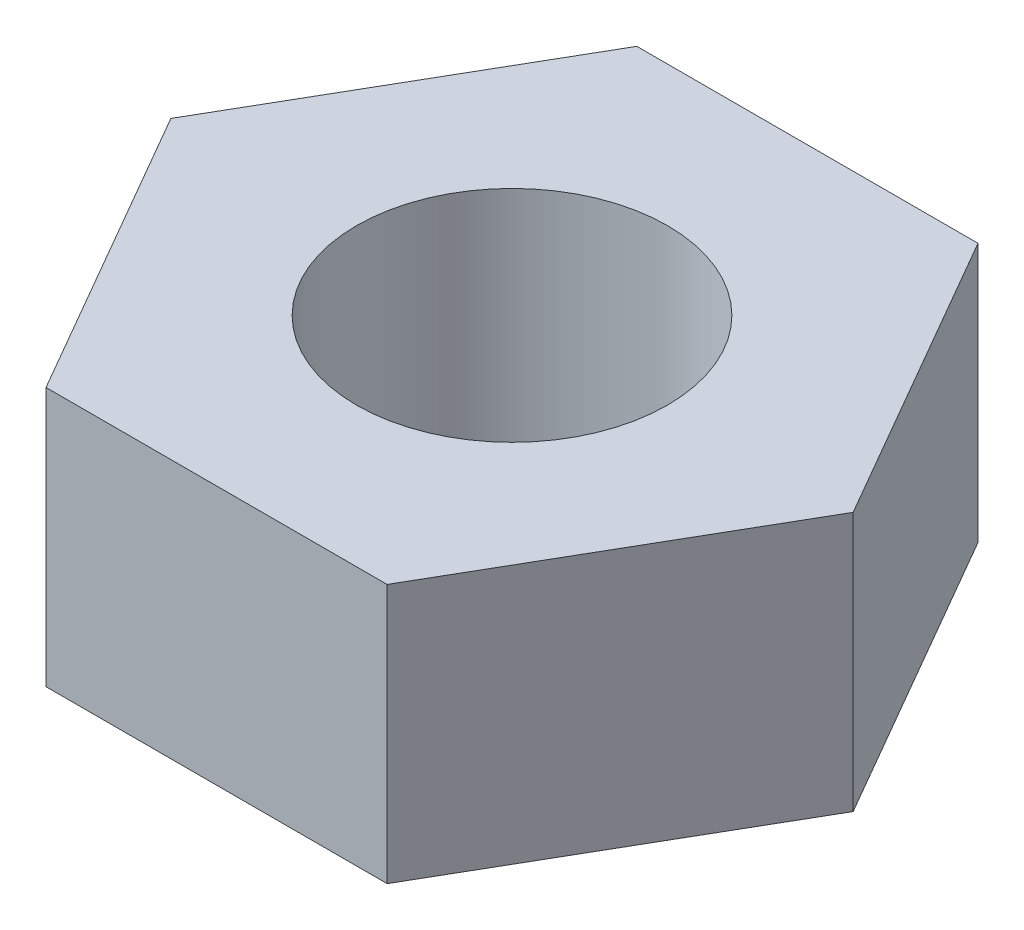
ISO-10303-21;
HEADER;
FILE_DESCRIPTION(('STEP AP214'),'2;1');
FILE_NAME('part.step','',(''),(''),'','','');
FILE_SCHEMA(('AUTOMOTIVE_DESIGN { 1 0 10303 214 1 1 1 1 }'));
ENDSEC;
DATA;
#1=APPLICATION_CONTEXT('core data for automotive mechanical design processes');
#2=APPLICATION_PROTOCOL_DEFINITION('international standard','automotive_design',2000,#1);
#3=PRODUCT_CONTEXT('',#1,'mechanical');
#4=PRODUCT('Part','Part','',(#3));
#5=PRODUCT_RELATED_PRODUCT_CATEGORY('part','',(#4));
#6=PRODUCT_DEFINITION_FORMATION('','',#4);
#7=PRODUCT_DEFINITION_CONTEXT('part definition',#1,'design');
#8=PRODUCT_DEFINITION('design','',#6,#7);
#9=PRODUCT_DEFINITION_SHAPE('','',#8);
#10=(LENGTH_UNIT() NAMED_UNIT(*) SI_UNIT(.MILLI.,.METRE.));
#11=(NAMED_UNIT(*) PLANE_ANGLE_UNIT() SI_UNIT($,.RADIAN.));
#12=(NAMED_UNIT(*) SI_UNIT($,.STERADIAN.) SOLID_ANGLE_UNIT());
#13=UNCERTAINTY_MEASURE_WITH_UNIT(LENGTH_MEASURE(1.E-05),#10,'distance_accuracy_value','');
#14=(GEOMETRIC_REPRESENTATION_CONTEXT(3) GLOBAL_UNCERTAINTY_ASSIGNED_CONTEXT((#13)) GLOBAL_UNIT_ASSIGNED_CONTEXT((#10,
#11,#12)) REPRESENTATION_CONTEXT('',''));
#15=CARTESIAN_POINT('',(0.,0.,0.));
#16=DIRECTION('',(0.,0.,1.));
#17=DIRECTION('',(1.,0.,0.));
#18=AXIS2_PLACEMENT_3D('',#15,#16,#17);
#19=CARTESIAN_POINT('',(0.,2.5,0.));
#20=DIRECTION('',(0.,1.,0.));
#21=DIRECTION('',(0.,0.,1.));
#22=AXIS2_PLACEMENT_3D('',#19,#20,#21);
#23=PLANE('',#22);
#24=DIRECTION('',(0.5,0.,-0.866025403784439));
#25=VECTOR('',#24,1.);
#26=CARTESIAN_POINT('',(1.64544826719043,2.5,2.85));
#27=LINE('',#26,#25);
#28=CARTESIAN_POINT('',(1.64544826719043,2.5,2.85));
#29=VERTEX_POINT('',#28);
#30=CARTESIAN_POINT('',(3.29089653438087,2.5,0.));
#31=VERTEX_POINT('',#30);
#32=EDGE_CURVE('E135',#29,#31,#27,.T.);
#33=ORIENTED_EDGE('',*,*,#32,.T.);
#34=DIRECTION('',(-0.5,0.,-0.866025403784439));
#35=VECTOR('',#34,1.);
#36=CARTESIAN_POINT('',(3.29089653438087,2.5,0.));
#37=LINE('',#36,#35);
#38=CARTESIAN_POINT('',(1.64544826719043,2.5,-2.85));
#39=VERTEX_POINT('',#38);
#40=EDGE_CURVE('E93',#31,#39,#37,.T.);
#41=ORIENTED_EDGE('',*,*,#40,.T.);
#42=DIRECTION('',(-1.,0.,0.));
#43=VECTOR('',#42,1.);
#44=CARTESIAN_POINT('',(1.64544826719043,2.5,-2.85));
#45=LINE('',#44,#43);
#46=CARTESIAN_POINT('',(-1.64544826719043,2.5,-2.85));
#47=VERTEX_POINT('',#46);
#48=EDGE_CURVE('E106',#39,#47,#45,.T.);
#49=ORIENTED_EDGE('',*,*,#48,.T.);
#50=DIRECTION('',(-0.5,0.,0.866025403784439));
#51=VECTOR('',#50,1.);
#52=CARTESIAN_POINT('',(-1.64544826719043,2.5,-2.85));
#53=LINE('',#52,#51);
#54=CARTESIAN_POINT('',(-3.29089653438087,2.5,0.));
#55=VERTEX_POINT('',#54);
#56=EDGE_CURVE('E100',#47,#55,#53,.T.);
#57=ORIENTED_EDGE('',*,*,#56,.T.);
#58=DIRECTION('',(0.5,0.,0.866025403784438));
#59=VECTOR('',#58,1.);
#60=CARTESIAN_POINT('',(-3.29089653438087,2.5,0.));
#61=LINE('',#60,#59);
#62=CARTESIAN_POINT('',(-1.64544826719043,2.5,2.85));
#63=VERTEX_POINT('',#62);
#64=EDGE_CURVE('E104',#55,#63,#61,.T.);
#65=ORIENTED_EDGE('',*,*,#64,.T.);
#66=DIRECTION('',(1.,0.,0.));
#67=VECTOR('',#66,1.);
#68=CARTESIAN_POINT('',(-1.64544826719043,2.5,2.85));
#69=LINE('',#68,#67);
#70=EDGE_CURVE('E56',#63,#29,#69,.T.);
#71=ORIENTED_EDGE('',*,*,#70,.T.);
#72=EDGE_LOOP('',(#33,#41,#49,#57,#65,#71));
#73=FACE_BOUND('',#72,.T.);
#74=CARTESIAN_POINT('',(0.,2.5,0.));
#75=DIRECTION('',(0.,1.,0.));
#76=DIRECTION('',(0.,0.,1.));
#77=AXIS2_PLACEMENT_3D('',#74,#75,#76);
#78=CIRCLE('',#77,1.50000000000006);
#79=CARTESIAN_POINT('',(0.,2.5,1.50000000000006));
#80=VERTEX_POINT('',#79);
#81=EDGE_CURVE('E128',#80,#80,#78,.T.);
#82=ORIENTED_EDGE('',*,*,#81,.F.);
#83=EDGE_LOOP('',(#82));
#84=FACE_BOUND('',#83,.T.);
#85=ADVANCED_FACE('F39',(#73,#84),#23,.T.);
#86=CARTESIAN_POINT('',(0.,0.,0.));
#87=DIRECTION('',(0.,1.,0.));
#88=DIRECTION('',(0.,0.,1.));
#89=AXIS2_PLACEMENT_3D('',#86,#87,#88);
#90=PLANE('',#89);
#91=DIRECTION('',(0.5,0.,-0.866025403784439));
#92=VECTOR('',#91,1.);
#93=CARTESIAN_POINT('',(1.64544826719043,0.,2.85));
#94=LINE('',#93,#92);
#95=CARTESIAN_POINT('',(1.64544826719043,0.,2.85));
#96=VERTEX_POINT('',#95);
#97=CARTESIAN_POINT('',(3.29089653438087,0.,0.));
#98=VERTEX_POINT('',#97);
#99=EDGE_CURVE('E124',#96,#98,#94,.T.);
#100=ORIENTED_EDGE('',*,*,#99,.F.);
#101=DIRECTION('',(1.,0.,0.));
#102=VECTOR('',#101,1.);
#103=CARTESIAN_POINT('',(-1.64544826719043,0.,2.85));
#104=LINE('',#103,#102);
#105=CARTESIAN_POINT('',(-1.64544826719043,0.,2.85));
#106=VERTEX_POINT('',#105);
#107=EDGE_CURVE('E85',#106,#96,#104,.T.);
#108=ORIENTED_EDGE('',*,*,#107,.F.);
#109=DIRECTION('',(0.5,0.,0.866025403784438));
#110=VECTOR('',#109,1.);
#111=CARTESIAN_POINT('',(-3.29089653438087,0.,0.));
#112=LINE('',#111,#110);
#113=CARTESIAN_POINT('',(-3.29089653438087,0.,0.));
#114=VERTEX_POINT('',#113);
#115=EDGE_CURVE('E79',#114,#106,#112,.T.);
#116=ORIENTED_EDGE('',*,*,#115,.F.);
#117=DIRECTION('',(-0.5,0.,0.866025403784439));
#118=VECTOR('',#117,1.);
#119=CARTESIAN_POINT('',(-1.64544826719043,0.,-2.85));
#120=LINE('',#119,#118);
#121=CARTESIAN_POINT('',(-1.64544826719043,0.,-2.85));
#122=VERTEX_POINT('',#121);
#123=EDGE_CURVE('E114',#122,#114,#120,.T.);
#124=ORIENTED_EDGE('',*,*,#123,.F.);
#125=DIRECTION('',(-1.,0.,0.));
#126=VECTOR('',#125,1.);
#127=CARTESIAN_POINT('',(1.64544826719043,0.,-2.85));
#128=LINE('',#127,#126);
#129=CARTESIAN_POINT('',(1.64544826719043,0.,-2.85));
#130=VERTEX_POINT('',#129);
#131=EDGE_CURVE('E130',#130,#122,#128,.T.);
#132=ORIENTED_EDGE('',*,*,#131,.F.);
#133=DIRECTION('',(-0.5,0.,-0.866025403784439));
#134=VECTOR('',#133,1.);
#135=CARTESIAN_POINT('',(3.29089653438087,0.,0.));
#136=LINE('',#135,#134);
#137=EDGE_CURVE('E127',#98,#130,#136,.T.);
#138=ORIENTED_EDGE('',*,*,#137,.F.);
#139=EDGE_LOOP('',(#100,#108,#116,#124,#132,#138));
#140=FACE_BOUND('',#139,.T.);
#141=CARTESIAN_POINT('',(0.,0.,0.));
#142=DIRECTION('',(0.,1.,0.));
#143=DIRECTION('',(0.,0.,1.));
#144=AXIS2_PLACEMENT_3D('',#141,#142,#143);
#145=CIRCLE('',#144,1.50000000000006);
#146=CARTESIAN_POINT('',(0.,0.,1.50000000000006));
#147=VERTEX_POINT('',#146);
#148=EDGE_CURVE('E210',#147,#147,#145,.T.);
#149=ORIENTED_EDGE('',*,*,#148,.T.);
#150=EDGE_LOOP('',(#149));
#151=FACE_BOUND('',#150,.T.);
#152=ADVANCED_FACE('F144',(#140,#151),#90,.F.);
#153=CARTESIAN_POINT('',(1.64544826719043,2.5,2.85));
#154=DIRECTION('',(-0.866025403784439,0.,-0.5));
#155=DIRECTION('',(-0.5,0.,0.866025403784439));
#156=AXIS2_PLACEMENT_3D('',#153,#154,#155);
#157=PLANE('',#156);
#158=ORIENTED_EDGE('',*,*,#99,.T.);
#159=DIRECTION('',(0.,-1.,0.));
#160=VECTOR('',#159,1.);
#161=CARTESIAN_POINT('',(3.29089653438087,2.5,0.));
#162=LINE('',#161,#160);
#163=EDGE_CURVE('E11',#31,#98,#162,.T.);
#164=ORIENTED_EDGE('',*,*,#163,.F.);
#165=ORIENTED_EDGE('',*,*,#32,.F.);
#166=DIRECTION('',(0.,-1.,0.));
#167=VECTOR('',#166,1.);
#168=CARTESIAN_POINT('',(1.64544826719043,2.5,2.85));
#169=LINE('',#168,#167);
#170=EDGE_CURVE('E120',#29,#96,#169,.T.);
#171=ORIENTED_EDGE('',*,*,#170,.T.);
#172=EDGE_LOOP('',(#158,#164,#165,#171));
#173=FACE_BOUND('',#172,.T.);
#174=ADVANCED_FACE('F41',(#173),#157,.F.);
#175=CARTESIAN_POINT('',(3.29089653438087,2.5,0.));
#176=DIRECTION('',(-0.866025403784438,0.,0.5));
#177=DIRECTION('',(0.5,0.,0.866025403784438));
#178=AXIS2_PLACEMENT_3D('',#175,#176,#177);
#179=PLANE('',#178);
#180=ORIENTED_EDGE('',*,*,#137,.T.);
#181=DIRECTION('',(0.,-1.,0.));
#182=VECTOR('',#181,1.);
#183=CARTESIAN_POINT('',(1.64544826719043,2.5,-2.85));
#184=LINE('',#183,#182);
#185=EDGE_CURVE('E48',#39,#130,#184,.T.);
#186=ORIENTED_EDGE('',*,*,#185,.F.);
#187=ORIENTED_EDGE('',*,*,#40,.F.);
#188=ORIENTED_EDGE('',*,*,#163,.T.);
#189=EDGE_LOOP('',(#180,#186,#187,#188));
#190=FACE_BOUND('',#189,.T.);
#191=ADVANCED_FACE('F169',(#190),#179,.F.);
#192=CARTESIAN_POINT('',(1.64544826719043,2.5,-2.85));
#193=DIRECTION('',(0.,0.,1.));
#194=DIRECTION('',(1.,0.,0.));
#195=AXIS2_PLACEMENT_3D('',#192,#193,#194);
#196=PLANE('',#195);
#197=ORIENTED_EDGE('',*,*,#131,.T.);
#198=DIRECTION('',(0.,-1.,0.));
#199=VECTOR('',#198,1.);
#200=CARTESIAN_POINT('',(-1.64544826719043,2.5,-2.85));
#201=LINE('',#200,#199);
#202=EDGE_CURVE('E115',#47,#122,#201,.T.);
#203=ORIENTED_EDGE('',*,*,#202,.F.);
#204=ORIENTED_EDGE('',*,*,#48,.F.);
#205=ORIENTED_EDGE('',*,*,#185,.T.);
#206=EDGE_LOOP('',(#197,#203,#204,#205));
#207=FACE_BOUND('',#206,.T.);
#208=ADVANCED_FACE('F141',(#207),#196,.F.);
#209=CARTESIAN_POINT('',(-1.64544826719043,2.5,-2.85));
#210=DIRECTION('',(0.866025403784439,0.,0.5));
#211=DIRECTION('',(0.5,0.,-0.866025403784439));
#212=AXIS2_PLACEMENT_3D('',#209,#210,#211);
#213=PLANE('',#212);
#214=ORIENTED_EDGE('',*,*,#123,.T.);
#215=DIRECTION('',(0.,-1.,0.));
#216=VECTOR('',#215,1.);
#217=CARTESIAN_POINT('',(-3.29089653438087,2.5,0.));
#218=LINE('',#217,#216);
#219=EDGE_CURVE('E111',#55,#114,#218,.T.);
#220=ORIENTED_EDGE('',*,*,#219,.F.);
#221=ORIENTED_EDGE('',*,*,#56,.F.);
#222=ORIENTED_EDGE('',*,*,#202,.T.);
#223=EDGE_LOOP('',(#214,#220,#221,#222));
#224=FACE_BOUND('',#223,.T.);
#225=ADVANCED_FACE('F112',(#224),#213,.F.);
#226=CARTESIAN_POINT('',(-3.29089653438087,2.5,0.));
#227=DIRECTION('',(0.866025403784438,0.,-0.5));
#228=DIRECTION('',(-0.5,0.,-0.866025403784439));
#229=AXIS2_PLACEMENT_3D('',#226,#227,#228);
#230=PLANE('',#229);
#231=ORIENTED_EDGE('',*,*,#115,.T.);
#232=DIRECTION('',(0.,-1.,0.));
#233=VECTOR('',#232,1.);
#234=CARTESIAN_POINT('',(-1.64544826719043,2.5,2.85));
#235=LINE('',#234,#233);
#236=EDGE_CURVE('E116',#63,#106,#235,.T.);
#237=ORIENTED_EDGE('',*,*,#236,.F.);
#238=ORIENTED_EDGE('',*,*,#64,.F.);
#239=ORIENTED_EDGE('',*,*,#219,.T.);
#240=EDGE_LOOP('',(#231,#237,#238,#239));
#241=FACE_BOUND('',#240,.T.);
#242=ADVANCED_FACE('F118',(#241),#230,.F.);
#243=CARTESIAN_POINT('',(-1.64544826719043,2.5,2.85));
#244=DIRECTION('',(0.,0.,-1.));
#245=DIRECTION('',(-1.,0.,0.));
#246=AXIS2_PLACEMENT_3D('',#243,#244,#245);
#247=PLANE('',#246);
#248=ORIENTED_EDGE('',*,*,#107,.T.);
#249=ORIENTED_EDGE('',*,*,#170,.F.);
#250=ORIENTED_EDGE('',*,*,#70,.F.);
#251=ORIENTED_EDGE('',*,*,#236,.T.);
#252=EDGE_LOOP('',(#248,#249,#250,#251));
#253=FACE_BOUND('',#252,.T.);
#254=ADVANCED_FACE('F149',(#253),#247,.F.);
#255=CARTESIAN_POINT('',(0.,2.5,0.));
#256=DIRECTION('',(0.,-1.,0.));
#257=DIRECTION('',(0.,0.,-1.));
#258=AXIS2_PLACEMENT_3D('',#255,#256,#257);
#259=CYLINDRICAL_SURFACE('',#258,1.50000000000006);
#260=ORIENTED_EDGE('',*,*,#81,.T.);
#261=EDGE_LOOP('',(#260));
#262=FACE_BOUND('',#261,.T.);
#263=ORIENTED_EDGE('',*,*,#148,.F.);
#264=EDGE_LOOP('',(#263));
#265=FACE_BOUND('',#264,.T.);
#266=ADVANCED_FACE('F151',(#262,#265),#259,.F.);
#267=CLOSED_SHELL('',(#85,#152,#174,#191,#208,#225,#242,#254,#266));
#268=MANIFOLD_SOLID_BREP('B2',#267);
#269=ADVANCED_BREP_SHAPE_REPRESENTATION('',(#18,#268),#14);
#270=SHAPE_DEFINITION_REPRESENTATION(#9,#269);
ENDSEC;
END-ISO-10303-21;
